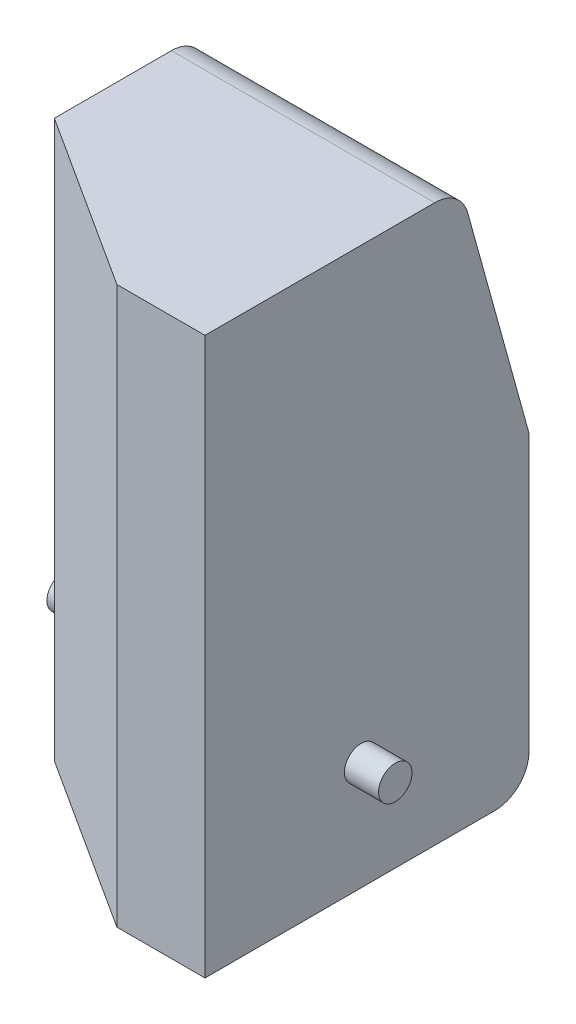
ISO-10303-21;
HEADER;
FILE_DESCRIPTION(('STEP AP214'),'2;1');
FILE_NAME('part.step','',(''),(''),'','','');
FILE_SCHEMA(('AUTOMOTIVE_DESIGN { 1 0 10303 214 1 1 1 1 }'));
ENDSEC;
DATA;
#1=APPLICATION_CONTEXT('core data for automotive mechanical design processes');
#2=APPLICATION_PROTOCOL_DEFINITION('international standard','automotive_design',2000,#1);
#3=PRODUCT_CONTEXT('',#1,'mechanical');
#4=PRODUCT('Part','Part','',(#3));
#5=PRODUCT_RELATED_PRODUCT_CATEGORY('part','',(#4));
#6=PRODUCT_DEFINITION_FORMATION('','',#4);
#7=PRODUCT_DEFINITION_CONTEXT('part definition',#1,'design');
#8=PRODUCT_DEFINITION('design','',#6,#7);
#9=PRODUCT_DEFINITION_SHAPE('','',#8);
#10=(LENGTH_UNIT() NAMED_UNIT(*) SI_UNIT(.MILLI.,.METRE.));
#11=(NAMED_UNIT(*) PLANE_ANGLE_UNIT() SI_UNIT($,.RADIAN.));
#12=(NAMED_UNIT(*) SI_UNIT($,.STERADIAN.) SOLID_ANGLE_UNIT());
#13=UNCERTAINTY_MEASURE_WITH_UNIT(LENGTH_MEASURE(1.E-05),#10,'distance_accuracy_value','');
#14=(GEOMETRIC_REPRESENTATION_CONTEXT(3) GLOBAL_UNCERTAINTY_ASSIGNED_CONTEXT((#13)) GLOBAL_UNIT_ASSIGNED_CONTEXT((#10,
#11,#12)) REPRESENTATION_CONTEXT('',''));
#15=CARTESIAN_POINT('',(0.,0.,0.));
#16=DIRECTION('',(0.,0.,1.));
#17=DIRECTION('',(1.,0.,0.));
#18=AXIS2_PLACEMENT_3D('',#15,#16,#17);
#19=CARTESIAN_POINT('',(-38.56,-163.,-47.45));
#20=DIRECTION('',(-1.,0.,0.));
#21=DIRECTION('',(0.,0.,1.));
#22=AXIS2_PLACEMENT_3D('',#19,#20,#21);
#23=PLANE('',#22);
#24=CARTESIAN_POINT('',(-38.56,-131.263122252948,1.72));
#25=DIRECTION('',(-1.,0.,0.));
#26=DIRECTION('',(0.,0.,1.));
#27=AXIS2_PLACEMENT_3D('',#24,#25,#26);
#28=CIRCLE('',#27,4.9);
#29=CARTESIAN_POINT('',(-38.56,-131.263122252948,-3.17999999999999));
#30=VERTEX_POINT('',#29);
#31=EDGE_CURVE('E12',#30,#30,#28,.T.);
#32=ORIENTED_EDGE('',*,*,#31,.F.);
#33=EDGE_LOOP('',(#32));
#34=FACE_BOUND('',#33,.T.);
#35=DIRECTION('',(0.,1.,0.));
#36=VECTOR('',#35,1.);
#37=CARTESIAN_POINT('',(-38.56,-163.,-47.45));
#38=LINE('',#37,#36);
#39=CARTESIAN_POINT('',(-38.56,-153.,-47.45));
#40=VERTEX_POINT('',#39);
#41=CARTESIAN_POINT('',(-38.56,-72.29,-47.45));
#42=VERTEX_POINT('',#41);
#43=EDGE_CURVE('E138',#40,#42,#38,.T.);
#44=ORIENTED_EDGE('',*,*,#43,.F.);
#45=CARTESIAN_POINT('',(-38.56,-153.,-37.45));
#46=DIRECTION('',(-1.,0.,0.));
#47=DIRECTION('',(0.,0.,1.));
#48=AXIS2_PLACEMENT_3D('',#45,#46,#47);
#49=CIRCLE('',#48,10.);
#50=CARTESIAN_POINT('',(-38.56,-163.,-37.45));
#51=VERTEX_POINT('',#50);
#52=EDGE_CURVE('E209',#40,#51,#49,.T.);
#53=ORIENTED_EDGE('',*,*,#52,.T.);
#54=DIRECTION('',(0.,0.,1.));
#55=VECTOR('',#54,1.);
#56=CARTESIAN_POINT('',(-38.56,-163.,-47.45));
#57=LINE('',#56,#55);
#58=CARTESIAN_POINT('',(-38.56,-163.,14.45));
#59=VERTEX_POINT('',#58);
#60=EDGE_CURVE('E246',#51,#59,#57,.T.);
#61=ORIENTED_EDGE('',*,*,#60,.T.);
#62=DIRECTION('',(0.,1.,0.));
#63=VECTOR('',#62,1.);
#64=CARTESIAN_POINT('',(-38.56,-163.,14.45));
#65=LINE('',#64,#63);
#66=CARTESIAN_POINT('',(-38.56,0.,14.45));
#67=VERTEX_POINT('',#66);
#68=EDGE_CURVE('E238',#59,#67,#65,.T.);
#69=ORIENTED_EDGE('',*,*,#68,.T.);
#70=DIRECTION('',(0.,0.,1.));
#71=VECTOR('',#70,1.);
#72=CARTESIAN_POINT('',(-38.56,0.,-47.45));
#73=LINE('',#72,#71);
#74=CARTESIAN_POINT('',(-38.56,0.,-19.8409770200254));
#75=VERTEX_POINT('',#74);
#76=EDGE_CURVE('E179',#75,#67,#73,.T.);
#77=ORIENTED_EDGE('',*,*,#76,.F.);
#78=CARTESIAN_POINT('',(-38.56,-10.,-19.8409770200254));
#79=DIRECTION('',(-1.,0.,0.));
#80=DIRECTION('',(0.,0.,1.));
#81=AXIS2_PLACEMENT_3D('',#78,#79,#80);
#82=CIRCLE('',#81,10.);
#83=CARTESIAN_POINT('',(-38.56,-7.33353339378044,-29.478920568206));
#84=VERTEX_POINT('',#83);
#85=EDGE_CURVE('E141',#75,#84,#82,.T.);
#86=ORIENTED_EDGE('',*,*,#85,.T.);
#87=DIRECTION('',(0.,-0.963794354818059,-0.266646660621956));
#88=VECTOR('',#87,1.);
#89=CARTESIAN_POINT('',(-38.56,0.,-27.45));
#90=LINE('',#89,#88);
#91=EDGE_CURVE('E136',#84,#42,#90,.T.);
#92=ORIENTED_EDGE('',*,*,#91,.T.);
#93=EDGE_LOOP('',(#44,#53,#61,#69,#77,#86,#92));
#94=FACE_BOUND('',#93,.T.);
#95=ADVANCED_FACE('F36',(#34,#94),#23,.T.);
#96=CARTESIAN_POINT('',(-38.56,-163.,-47.45));
#97=DIRECTION('',(0.,0.,-1.));
#98=DIRECTION('',(-1.,0.,0.));
#99=AXIS2_PLACEMENT_3D('',#96,#97,#98);
#100=PLANE('',#99);
#101=CARTESIAN_POINT('',(0.,-129.37,-47.45));
#102=DIRECTION('',(0.,0.,-1.));
#103=DIRECTION('',(-1.,0.,0.));
#104=AXIS2_PLACEMENT_3D('',#101,#102,#103);
#105=CIRCLE('',#104,10.5);
#106=CARTESIAN_POINT('',(-10.5,-129.37,-47.45));
#107=VERTEX_POINT('',#106);
#108=EDGE_CURVE('E326',#107,#107,#105,.T.);
#109=ORIENTED_EDGE('',*,*,#108,.F.);
#110=EDGE_LOOP('',(#109));
#111=FACE_BOUND('',#110,.T.);
#112=DIRECTION('',(0.,1.,0.));
#113=VECTOR('',#112,1.);
#114=CARTESIAN_POINT('',(38.56,-163.,-47.45));
#115=LINE('',#114,#113);
#116=CARTESIAN_POINT('',(38.56,-153.,-47.45));
#117=VERTEX_POINT('',#116);
#118=CARTESIAN_POINT('',(38.56,-72.29,-47.45));
#119=VERTEX_POINT('',#118);
#120=EDGE_CURVE('E159',#117,#119,#115,.T.);
#121=ORIENTED_EDGE('',*,*,#120,.F.);
#122=DIRECTION('',(-1.,0.,0.));
#123=VECTOR('',#122,1.);
#124=CARTESIAN_POINT('',(-38.56,-153.,-47.45));
#125=LINE('',#124,#123);
#126=EDGE_CURVE('E157',#117,#40,#125,.T.);
#127=ORIENTED_EDGE('',*,*,#126,.T.);
#128=ORIENTED_EDGE('',*,*,#43,.T.);
#129=DIRECTION('',(1.,0.,0.));
#130=VECTOR('',#129,1.);
#131=CARTESIAN_POINT('',(-38.56,-72.29,-47.45));
#132=LINE('',#131,#130);
#133=CARTESIAN_POINT('',(12.75,-72.29,-47.45));
#134=VERTEX_POINT('',#133);
#135=EDGE_CURVE('E155',#42,#134,#132,.T.);
#136=ORIENTED_EDGE('',*,*,#135,.T.);
#137=EDGE_CURVE('E144',#134,#119,#132,.T.);
#138=ORIENTED_EDGE('',*,*,#137,.T.);
#139=EDGE_LOOP('',(#121,#127,#128,#136,#138));
#140=FACE_BOUND('',#139,.T.);
#141=ADVANCED_FACE('F152',(#111,#140),#100,.T.);
#142=CARTESIAN_POINT('',(38.56,-163.,-47.45));
#143=DIRECTION('',(1.,0.,0.));
#144=DIRECTION('',(0.,0.,-1.));
#145=AXIS2_PLACEMENT_3D('',#142,#143,#144);
#146=PLANE('',#145);
#147=CARTESIAN_POINT('',(38.56,-131.263122252948,1.71999999999999));
#148=DIRECTION('',(1.,0.,0.));
#149=DIRECTION('',(0.,0.,-1.));
#150=AXIS2_PLACEMENT_3D('',#147,#148,#149);
#151=CIRCLE('',#150,4.9);
#152=CARTESIAN_POINT('',(38.56,-131.263122252948,-3.18));
#153=VERTEX_POINT('',#152);
#154=EDGE_CURVE('E40',#153,#153,#151,.T.);
#155=ORIENTED_EDGE('',*,*,#154,.F.);
#156=EDGE_LOOP('',(#155));
#157=FACE_BOUND('',#156,.T.);
#158=DIRECTION('',(0.,0.,-1.));
#159=VECTOR('',#158,1.);
#160=CARTESIAN_POINT('',(38.56,-163.,-47.45));
#161=LINE('',#160,#159);
#162=CARTESIAN_POINT('',(38.56,-163.,47.45));
#163=VERTEX_POINT('',#162);
#164=CARTESIAN_POINT('',(38.56,-163.,-37.45));
#165=VERTEX_POINT('',#164);
#166=EDGE_CURVE('E231',#163,#165,#161,.T.);
#167=ORIENTED_EDGE('',*,*,#166,.T.);
#168=CARTESIAN_POINT('',(38.56,-153.,-37.45));
#169=DIRECTION('',(1.,0.,0.));
#170=DIRECTION('',(0.,0.,-1.));
#171=AXIS2_PLACEMENT_3D('',#168,#169,#170);
#172=CIRCLE('',#171,10.);
#173=EDGE_CURVE('E214',#165,#117,#172,.T.);
#174=ORIENTED_EDGE('',*,*,#173,.T.);
#175=ORIENTED_EDGE('',*,*,#120,.T.);
#176=DIRECTION('',(0.,-0.963794354818059,-0.266646660621956));
#177=VECTOR('',#176,1.);
#178=CARTESIAN_POINT('',(38.56,0.,-27.45));
#179=LINE('',#178,#177);
#180=CARTESIAN_POINT('',(38.56,-7.33353339378044,-29.478920568206));
#181=VERTEX_POINT('',#180);
#182=EDGE_CURVE('E145',#181,#119,#179,.T.);
#183=ORIENTED_EDGE('',*,*,#182,.F.);
#184=CARTESIAN_POINT('',(38.56,-10.,-19.8409770200254));
#185=DIRECTION('',(1.,0.,0.));
#186=DIRECTION('',(0.,0.,-1.));
#187=AXIS2_PLACEMENT_3D('',#184,#185,#186);
#188=CIRCLE('',#187,10.);
#189=CARTESIAN_POINT('',(38.56,0.,-19.8409770200254));
#190=VERTEX_POINT('',#189);
#191=EDGE_CURVE('E52',#181,#190,#188,.T.);
#192=ORIENTED_EDGE('',*,*,#191,.T.);
#193=DIRECTION('',(0.,0.,-1.));
#194=VECTOR('',#193,1.);
#195=CARTESIAN_POINT('',(38.56,0.,-47.45));
#196=LINE('',#195,#194);
#197=CARTESIAN_POINT('',(38.56,0.,47.45));
#198=VERTEX_POINT('',#197);
#199=EDGE_CURVE('E252',#198,#190,#196,.T.);
#200=ORIENTED_EDGE('',*,*,#199,.F.);
#201=DIRECTION('',(0.,1.,0.));
#202=VECTOR('',#201,1.);
#203=CARTESIAN_POINT('',(38.56,-163.,47.45));
#204=LINE('',#203,#202);
#205=EDGE_CURVE('E234',#163,#198,#204,.T.);
#206=ORIENTED_EDGE('',*,*,#205,.F.);
#207=EDGE_LOOP('',(#167,#174,#175,#183,#192,#200,#206));
#208=FACE_BOUND('',#207,.T.);
#209=ADVANCED_FACE('F225',(#157,#208),#146,.T.);
#210=CARTESIAN_POINT('',(12.75,-163.,47.45));
#211=DIRECTION('',(0.,0.,1.));
#212=DIRECTION('',(1.,0.,0.));
#213=AXIS2_PLACEMENT_3D('',#210,#211,#212);
#214=PLANE('',#213);
#215=DIRECTION('',(1.,0.,0.));
#216=VECTOR('',#215,1.);
#217=CARTESIAN_POINT('',(12.75,0.,47.45));
#218=LINE('',#217,#216);
#219=CARTESIAN_POINT('',(12.75,0.,47.45));
#220=VERTEX_POINT('',#219);
#221=EDGE_CURVE('E255',#220,#198,#218,.T.);
#222=ORIENTED_EDGE('',*,*,#221,.F.);
#223=DIRECTION('',(0.,1.,0.));
#224=VECTOR('',#223,1.);
#225=CARTESIAN_POINT('',(12.75,-163.,47.45));
#226=LINE('',#225,#224);
#227=CARTESIAN_POINT('',(12.75,-163.,47.45));
#228=VERTEX_POINT('',#227);
#229=EDGE_CURVE('E268',#228,#220,#226,.T.);
#230=ORIENTED_EDGE('',*,*,#229,.F.);
#231=DIRECTION('',(1.,0.,0.));
#232=VECTOR('',#231,1.);
#233=CARTESIAN_POINT('',(12.75,-163.,47.45));
#234=LINE('',#233,#232);
#235=EDGE_CURVE('E239',#228,#163,#234,.T.);
#236=ORIENTED_EDGE('',*,*,#235,.T.);
#237=ORIENTED_EDGE('',*,*,#205,.T.);
#238=EDGE_LOOP('',(#222,#230,#236,#237));
#239=FACE_BOUND('',#238,.T.);
#240=ADVANCED_FACE('F227',(#239),#214,.T.);
#241=CARTESIAN_POINT('',(-38.56,-163.,14.45));
#242=DIRECTION('',(-0.540931558391022,0.,0.84106661397101));
#243=DIRECTION('',(0.84106661397101,0.,0.540931558391022));
#244=AXIS2_PLACEMENT_3D('',#241,#242,#243);
#245=PLANE('',#244);
#246=DIRECTION('',(0.84106661397101,0.,0.540931558391022));
#247=VECTOR('',#246,1.);
#248=CARTESIAN_POINT('',(-38.56,0.,14.45));
#249=LINE('',#248,#247);
#250=EDGE_CURVE('E261',#67,#220,#249,.T.);
#251=ORIENTED_EDGE('',*,*,#250,.F.);
#252=ORIENTED_EDGE('',*,*,#68,.F.);
#253=DIRECTION('',(0.84106661397101,0.,0.540931558391022));
#254=VECTOR('',#253,1.);
#255=CARTESIAN_POINT('',(-38.56,-163.,14.45));
#256=LINE('',#255,#254);
#257=EDGE_CURVE('E251',#59,#228,#256,.T.);
#258=ORIENTED_EDGE('',*,*,#257,.T.);
#259=ORIENTED_EDGE('',*,*,#229,.T.);
#260=EDGE_LOOP('',(#251,#252,#258,#259));
#261=FACE_BOUND('',#260,.T.);
#262=ADVANCED_FACE('F271',(#261),#245,.T.);
#263=CARTESIAN_POINT('',(0.,-163.,0.));
#264=DIRECTION('',(0.,1.,0.));
#265=DIRECTION('',(0.,0.,1.));
#266=AXIS2_PLACEMENT_3D('',#263,#264,#265);
#267=PLANE('',#266);
#268=ORIENTED_EDGE('',*,*,#60,.F.);
#269=DIRECTION('',(-1.,0.,0.));
#270=VECTOR('',#269,1.);
#271=CARTESIAN_POINT('',(38.56,-163.,-37.45));
#272=LINE('',#271,#270);
#273=EDGE_CURVE('E211',#51,#165,#272,.F.);
#274=ORIENTED_EDGE('',*,*,#273,.T.);
#275=ORIENTED_EDGE('',*,*,#166,.F.);
#276=ORIENTED_EDGE('',*,*,#235,.F.);
#277=ORIENTED_EDGE('',*,*,#257,.F.);
#278=EDGE_LOOP('',(#268,#274,#275,#276,#277));
#279=FACE_BOUND('',#278,.T.);
#280=ADVANCED_FACE('F249',(#279),#267,.F.);
#281=CARTESIAN_POINT('',(0.,0.,0.));
#282=DIRECTION('',(0.,1.,0.));
#283=DIRECTION('',(0.,0.,1.));
#284=AXIS2_PLACEMENT_3D('',#281,#282,#283);
#285=PLANE('',#284);
#286=ORIENTED_EDGE('',*,*,#199,.T.);
#287=DIRECTION('',(1.,0.,0.));
#288=VECTOR('',#287,1.);
#289=CARTESIAN_POINT('',(-38.56,0.,-19.8409770200254));
#290=LINE('',#289,#288);
#291=EDGE_CURVE('E217',#190,#75,#290,.F.);
#292=ORIENTED_EDGE('',*,*,#291,.T.);
#293=ORIENTED_EDGE('',*,*,#76,.T.);
#294=ORIENTED_EDGE('',*,*,#250,.T.);
#295=ORIENTED_EDGE('',*,*,#221,.T.);
#296=EDGE_LOOP('',(#286,#292,#293,#294,#295));
#297=FACE_BOUND('',#296,.T.);
#298=ADVANCED_FACE('F273',(#297),#285,.T.);
#299=CARTESIAN_POINT('',(-38.56,0.,-27.45));
#300=DIRECTION('',(0.,-0.266646660621956,0.96379435481806));
#301=DIRECTION('',(0.,-0.96379435481806,-0.266646660621956));
#302=AXIS2_PLACEMENT_3D('',#299,#300,#301);
#303=PLANE('',#302);
#304=ORIENTED_EDGE('',*,*,#91,.F.);
#305=DIRECTION('',(1.,0.,0.));
#306=VECTOR('',#305,1.);
#307=CARTESIAN_POINT('',(38.56,-7.33353339378044,-29.478920568206));
#308=LINE('',#307,#306);
#309=EDGE_CURVE('E216',#84,#181,#308,.T.);
#310=ORIENTED_EDGE('',*,*,#309,.T.);
#311=ORIENTED_EDGE('',*,*,#182,.T.);
#312=ORIENTED_EDGE('',*,*,#137,.F.);
#313=DIRECTION('',(-0.328725796039172,0.910231876645725,0.25182788121337));
#314=VECTOR('',#313,1.);
#315=CARTESIAN_POINT('',(-16.0806134286694,7.5411044713329,-25.3636521036567));
#316=LINE('',#315,#314);
#317=CARTESIAN_POINT('',(11.1254993804371,-67.7918064740479,-46.205514310153));
#318=VERTEX_POINT('',#317);
#319=EDGE_CURVE('E185',#134,#318,#316,.T.);
#320=ORIENTED_EDGE('',*,*,#319,.T.);
#321=DIRECTION('',(1.,0.,0.));
#322=VECTOR('',#321,1.);
#323=CARTESIAN_POINT('',(-38.56,-67.7918064740479,-46.205514310153));
#324=LINE('',#323,#322);
#325=CARTESIAN_POINT('',(-36.9354993804372,-67.7918064740479,-46.205514310153));
#326=VERTEX_POINT('',#325);
#327=EDGE_CURVE('E158',#326,#318,#324,.T.);
#328=ORIENTED_EDGE('',*,*,#327,.F.);
#329=DIRECTION('',(-0.328725796039172,-0.910231876645725,-0.25182788121337));
#330=VECTOR('',#329,1.);
#331=CARTESIAN_POINT('',(-15.2739784705759,-7.81170431487893,-29.6112129796318));
#332=LINE('',#331,#330);
#333=EDGE_CURVE('E167',#326,#42,#332,.T.);
#334=ORIENTED_EDGE('',*,*,#333,.T.);
#335=EDGE_LOOP('',(#304,#310,#311,#312,#320,#328,#334));
#336=FACE_BOUND('',#335,.T.);
#337=ADVANCED_FACE('F182',(#336),#303,.F.);
#338=CARTESIAN_POINT('',(1.99499999999997,-49.5114920011426,-54.5498924883401));
#339=DIRECTION('',(0.910425743719144,0.376320584308292,-0.171778296065915));
#340=DIRECTION('',(-0.381998753667224,0.924162838571584,0.));
#341=AXIS2_PLACEMENT_3D('',#338,#339,#340);
#342=PLANE('',#341);
#343=DIRECTION('',(0.413672533743109,-0.828220198101095,0.378055998873101));
#344=VECTOR('',#343,1.);
#345=CARTESIAN_POINT('',(1.99499999999997,-50.7572476318941,-57.2790119266299));
#346=LINE('',#345,#344);
#347=CARTESIAN_POINT('',(4.65911149116721,-56.0911065831103,-54.8442761181171));
#348=VERTEX_POINT('',#347);
#349=EDGE_CURVE('E177',#348,#134,#346,.T.);
#350=ORIENTED_EDGE('',*,*,#349,.F.);
#351=DIRECTION('',(0.,-0.415251876917188,-0.909706479429905));
#352=VECTOR('',#351,1.);
#353=CARTESIAN_POINT('',(4.65911149116721,-54.8453509523587,-52.1151566798274));
#354=LINE('',#353,#352);
#355=CARTESIAN_POINT('',(4.65911149116721,-54.8453509523587,-52.1151566798274));
#356=VERTEX_POINT('',#355);
#357=EDGE_CURVE('E205',#348,#356,#354,.F.);
#358=ORIENTED_EDGE('',*,*,#357,.T.);
#359=DIRECTION('',(0.413672533743109,-0.828220198101095,0.378055998873101));
#360=VECTOR('',#359,1.);
#361=CARTESIAN_POINT('',(1.99499999999997,-49.5114920011426,-54.5498924883401));
#362=LINE('',#361,#360);
#363=EDGE_CURVE('E309',#356,#318,#362,.T.);
#364=ORIENTED_EDGE('',*,*,#363,.T.);
#365=ORIENTED_EDGE('',*,*,#319,.F.);
#366=EDGE_LOOP('',(#350,#358,#364,#365));
#367=FACE_BOUND('',#366,.T.);
#368=ADVANCED_FACE('F358',(#367),#342,.T.);
#369=CARTESIAN_POINT('',(-38.56,-71.0442443692484,-44.7208805617103));
#370=DIRECTION('',(-0.910425743719144,0.376320584308292,-0.171778296065915));
#371=DIRECTION('',(-0.381998753667224,-0.924162838571584,0.));
#372=AXIS2_PLACEMENT_3D('',#369,#370,#371);
#373=PLANE('',#372);
#374=DIRECTION('',(0.413672533743109,0.828220198101095,-0.378055998873102));
#375=VECTOR('',#374,1.);
#376=CARTESIAN_POINT('',(-38.56,-71.0442443692484,-44.7208805617103));
#377=LINE('',#376,#375);
#378=CARTESIAN_POINT('',(-30.4691114911673,-54.8453509523587,-52.1151566798274));
#379=VERTEX_POINT('',#378);
#380=EDGE_CURVE('E314',#326,#379,#377,.T.);
#381=ORIENTED_EDGE('',*,*,#380,.T.);
#382=DIRECTION('',(0.,-0.415251876917188,-0.909706479429905));
#383=VECTOR('',#382,1.);
#384=CARTESIAN_POINT('',(-30.4691114911673,-54.8453509523587,-52.1151566798274));
#385=LINE('',#384,#383);
#386=CARTESIAN_POINT('',(-30.4691114911673,-56.0911065831103,-54.8442761181171));
#387=VERTEX_POINT('',#386);
#388=EDGE_CURVE('E170',#379,#387,#385,.T.);
#389=ORIENTED_EDGE('',*,*,#388,.T.);
#390=DIRECTION('',(0.413672533743109,0.828220198101095,-0.378055998873102));
#391=VECTOR('',#390,1.);
#392=CARTESIAN_POINT('',(-38.56,-72.29,-47.45));
#393=LINE('',#392,#391);
#394=EDGE_CURVE('E164',#42,#387,#393,.T.);
#395=ORIENTED_EDGE('',*,*,#394,.F.);
#396=ORIENTED_EDGE('',*,*,#333,.F.);
#397=EDGE_LOOP('',(#381,#389,#395,#396));
#398=FACE_BOUND('',#397,.T.);
#399=ADVANCED_FACE('F166',(#398),#373,.T.);
#400=CARTESIAN_POINT('',(0.,-29.1440919744454,-63.8469583884417));
#401=DIRECTION('',(0.,-0.415251876917188,-0.909706479429905));
#402=DIRECTION('',(0.,0.909706479429905,-0.415251876917188));
#403=AXIS2_PLACEMENT_3D('',#400,#401,#402);
#404=PLANE('',#403);
#405=DIRECTION('',(1.,0.,0.));
#406=VECTOR('',#405,1.);
#407=CARTESIAN_POINT('',(-27.805,-49.5114920011426,-54.5498924883401));
#408=LINE('',#407,#406);
#409=CARTESIAN_POINT('',(-21.3648540539758,-49.5114920011426,-54.5498924883401));
#410=VERTEX_POINT('',#409);
#411=CARTESIAN_POINT('',(-4.44514594602423,-49.5114920011426,-54.5498924883401));
#412=VERTEX_POINT('',#411);
#413=EDGE_CURVE('E310',#410,#412,#408,.T.);
#414=ORIENTED_EDGE('',*,*,#413,.F.);
#415=CARTESIAN_POINT('',(-21.3648540539758,-58.6085567954416,-50.3973737191683));
#416=DIRECTION('',(0.,-0.415251876917188,-0.909706479429905));
#417=DIRECTION('',(0.,0.909706479429905,-0.415251876917188));
#418=AXIS2_PLACEMENT_3D('',#415,#416,#417);
#419=CIRCLE('',#418,10.);
#420=EDGE_CURVE('E203',#410,#379,#419,.F.);
#421=ORIENTED_EDGE('',*,*,#420,.T.);
#422=ORIENTED_EDGE('',*,*,#380,.F.);
#423=ORIENTED_EDGE('',*,*,#327,.T.);
#424=ORIENTED_EDGE('',*,*,#363,.F.);
#425=CARTESIAN_POINT('',(-4.44514594602423,-58.6085567954416,-50.3973737191683));
#426=DIRECTION('',(0.,-0.415251876917188,-0.909706479429905));
#427=DIRECTION('',(0.,0.909706479429905,-0.415251876917188));
#428=AXIS2_PLACEMENT_3D('',#425,#426,#427);
#429=CIRCLE('',#428,10.);
#430=EDGE_CURVE('E201',#356,#412,#429,.F.);
#431=ORIENTED_EDGE('',*,*,#430,.T.);
#432=EDGE_LOOP('',(#414,#421,#422,#423,#424,#431));
#433=FACE_BOUND('',#432,.T.);
#434=ADVANCED_FACE('F351',(#433),#404,.F.);
#435=CARTESIAN_POINT('',(-27.805,-49.5114920011426,-54.5498924883401));
#436=DIRECTION('',(0.,0.909706479429905,-0.415251876917188));
#437=DIRECTION('',(0.,0.415251876917188,0.909706479429905));
#438=AXIS2_PLACEMENT_3D('',#435,#436,#437);
#439=PLANE('',#438);
#440=DIRECTION('',(1.,0.,0.));
#441=VECTOR('',#440,1.);
#442=CARTESIAN_POINT('',(-27.805,-50.7572476318941,-57.2790119266299));
#443=LINE('',#442,#441);
#444=CARTESIAN_POINT('',(-21.3648540539758,-50.7572476318941,-57.2790119266299));
#445=VERTEX_POINT('',#444);
#446=CARTESIAN_POINT('',(-4.44514594602423,-50.7572476318941,-57.2790119266299));
#447=VERTEX_POINT('',#446);
#448=EDGE_CURVE('E172',#445,#447,#443,.T.);
#449=ORIENTED_EDGE('',*,*,#448,.F.);
#450=DIRECTION('',(0.,-0.415251876917188,-0.909706479429905));
#451=VECTOR('',#450,1.);
#452=CARTESIAN_POINT('',(-21.3648540539758,-49.5114920011426,-54.5498924883401));
#453=LINE('',#452,#451);
#454=EDGE_CURVE('E199',#445,#410,#453,.F.);
#455=ORIENTED_EDGE('',*,*,#454,.T.);
#456=ORIENTED_EDGE('',*,*,#413,.T.);
#457=DIRECTION('',(0.,-0.415251876917188,-0.909706479429905));
#458=VECTOR('',#457,1.);
#459=CARTESIAN_POINT('',(-4.44514594602423,-49.5114920011426,-54.5498924883401));
#460=LINE('',#459,#458);
#461=EDGE_CURVE('E196',#412,#447,#460,.T.);
#462=ORIENTED_EDGE('',*,*,#461,.T.);
#463=EDGE_LOOP('',(#449,#455,#456,#462));
#464=FACE_BOUND('',#463,.T.);
#465=ADVANCED_FACE('F354',(#464),#439,.T.);
#466=CARTESIAN_POINT('',(0.,-30.3898476051969,-66.5760778267314));
#467=DIRECTION('',(0.,-0.415251876917188,-0.909706479429905));
#468=DIRECTION('',(0.,0.909706479429905,-0.415251876917188));
#469=AXIS2_PLACEMENT_3D('',#466,#467,#468);
#470=PLANE('',#469);
#471=ORIENTED_EDGE('',*,*,#394,.T.);
#472=CARTESIAN_POINT('',(-21.3648540539758,-59.8543124261932,-53.126493157458));
#473=DIRECTION('',(0.,-0.415251876917188,-0.909706479429905));
#474=DIRECTION('',(0.,0.909706479429905,-0.415251876917188));
#475=AXIS2_PLACEMENT_3D('',#472,#473,#474);
#476=CIRCLE('',#475,10.);
#477=EDGE_CURVE('E194',#387,#445,#476,.T.);
#478=ORIENTED_EDGE('',*,*,#477,.T.);
#479=ORIENTED_EDGE('',*,*,#448,.T.);
#480=CARTESIAN_POINT('',(-4.44514594602423,-59.8543124261932,-53.126493157458));
#481=DIRECTION('',(0.,-0.415251876917188,-0.909706479429905));
#482=DIRECTION('',(0.,0.909706479429905,-0.415251876917188));
#483=AXIS2_PLACEMENT_3D('',#480,#481,#482);
#484=CIRCLE('',#483,10.);
#485=EDGE_CURVE('E192',#447,#348,#484,.T.);
#486=ORIENTED_EDGE('',*,*,#485,.T.);
#487=ORIENTED_EDGE('',*,*,#349,.T.);
#488=ORIENTED_EDGE('',*,*,#135,.F.);
#489=EDGE_LOOP('',(#471,#478,#479,#486,#487,#488));
#490=FACE_BOUND('',#489,.T.);
#491=ADVANCED_FACE('F175',(#490),#470,.T.);
#492=CARTESIAN_POINT('',(-21.3648540539758,-58.6085567954416,-50.3973737191683));
#493=DIRECTION('',(0.,-0.415251876917188,-0.909706479429905));
#494=DIRECTION('',(0.,0.909706479429905,-0.415251876917188));
#495=AXIS2_PLACEMENT_3D('',#492,#493,#494);
#496=CYLINDRICAL_SURFACE('',#495,10.);
#497=ORIENTED_EDGE('',*,*,#420,.F.);
#498=ORIENTED_EDGE('',*,*,#454,.F.);
#499=ORIENTED_EDGE('',*,*,#477,.F.);
#500=ORIENTED_EDGE('',*,*,#388,.F.);
#501=EDGE_LOOP('',(#497,#498,#499,#500));
#502=FACE_BOUND('',#501,.T.);
#503=ADVANCED_FACE('F291',(#502),#496,.T.);
#504=CARTESIAN_POINT('',(-4.44514594602423,-58.6085567954416,-50.3973737191683));
#505=DIRECTION('',(0.,-0.415251876917188,-0.909706479429905));
#506=DIRECTION('',(0.,0.909706479429905,-0.415251876917188));
#507=AXIS2_PLACEMENT_3D('',#504,#505,#506);
#508=CYLINDRICAL_SURFACE('',#507,10.);
#509=ORIENTED_EDGE('',*,*,#430,.F.);
#510=ORIENTED_EDGE('',*,*,#357,.F.);
#511=ORIENTED_EDGE('',*,*,#485,.F.);
#512=ORIENTED_EDGE('',*,*,#461,.F.);
#513=EDGE_LOOP('',(#509,#510,#511,#512));
#514=FACE_BOUND('',#513,.T.);
#515=ADVANCED_FACE('F294',(#514),#508,.T.);
#516=CARTESIAN_POINT('',(-38.56,-153.,-37.45));
#517=DIRECTION('',(1.,0.,0.));
#518=DIRECTION('',(0.,0.,-1.));
#519=AXIS2_PLACEMENT_3D('',#516,#517,#518);
#520=CYLINDRICAL_SURFACE('',#519,10.);
#521=ORIENTED_EDGE('',*,*,#173,.F.);
#522=ORIENTED_EDGE('',*,*,#273,.F.);
#523=ORIENTED_EDGE('',*,*,#52,.F.);
#524=ORIENTED_EDGE('',*,*,#126,.F.);
#525=EDGE_LOOP('',(#521,#522,#523,#524));
#526=FACE_BOUND('',#525,.T.);
#527=ADVANCED_FACE('F243',(#526),#520,.T.);
#528=CARTESIAN_POINT('',(-38.56,-10.,-19.8409770200254));
#529=DIRECTION('',(-1.,0.,0.));
#530=DIRECTION('',(0.,0.,1.));
#531=AXIS2_PLACEMENT_3D('',#528,#529,#530);
#532=CYLINDRICAL_SURFACE('',#531,10.);
#533=ORIENTED_EDGE('',*,*,#85,.F.);
#534=ORIENTED_EDGE('',*,*,#291,.F.);
#535=ORIENTED_EDGE('',*,*,#191,.F.);
#536=ORIENTED_EDGE('',*,*,#309,.F.);
#537=EDGE_LOOP('',(#533,#534,#535,#536));
#538=FACE_BOUND('',#537,.T.);
#539=ADVANCED_FACE('F38',(#538),#532,.T.);
#540=CARTESIAN_POINT('',(48.56,-131.263122252948,1.71999999999999));
#541=DIRECTION('',(1.,0.,0.));
#542=DIRECTION('',(0.,0.,-1.));
#543=AXIS2_PLACEMENT_3D('',#540,#541,#542);
#544=PLANE('',#543);
#545=CARTESIAN_POINT('',(48.56,-131.263122252948,1.71999999999999));
#546=DIRECTION('',(1.,0.,0.));
#547=DIRECTION('',(0.,0.,-1.));
#548=AXIS2_PLACEMENT_3D('',#545,#546,#547);
#549=CIRCLE('',#548,4.9);
#550=CARTESIAN_POINT('',(48.56,-131.263122252948,-3.18000000000001));
#551=VERTEX_POINT('',#550);
#552=EDGE_CURVE('E322',#551,#551,#549,.T.);
#553=ORIENTED_EDGE('',*,*,#552,.T.);
#554=EDGE_LOOP('',(#553));
#555=FACE_BOUND('',#554,.T.);
#556=ADVANCED_FACE('F302',(#555),#544,.T.);
#557=CARTESIAN_POINT('',(-72.4192929112563,-131.263122252948,1.72000000000001));
#558=DIRECTION('',(1.,0.,0.));
#559=DIRECTION('',(0.,0.,-1.));
#560=AXIS2_PLACEMENT_3D('',#557,#558,#559);
#561=CYLINDRICAL_SURFACE('',#560,4.9);
#562=CARTESIAN_POINT('',(38.56,-131.263122252948,-3.18));
#563=CARTESIAN_POINT('',(38.6641666666667,-131.263122252948,-3.18));
#564=CARTESIAN_POINT('',(38.7683333333333,-131.263122252948,-3.18));
#565=CARTESIAN_POINT('',(38.9766666666667,-131.263122252948,-3.18));
#566=CARTESIAN_POINT('',(39.0808333333333,-131.263122252948,-3.18));
#567=CARTESIAN_POINT('',(39.2891666666667,-131.263122252948,-3.18));
#568=CARTESIAN_POINT('',(39.3933333333333,-131.263122252948,-3.18));
#569=CARTESIAN_POINT('',(39.6016666666667,-131.263122252948,-3.18));
#570=CARTESIAN_POINT('',(39.7058333333333,-131.263122252948,-3.18));
#571=CARTESIAN_POINT('',(39.9141666666667,-131.263122252948,-3.18));
#572=CARTESIAN_POINT('',(40.0183333333333,-131.263122252948,-3.18));
#573=CARTESIAN_POINT('',(40.2266666666667,-131.263122252948,-3.18));
#574=CARTESIAN_POINT('',(40.3308333333333,-131.263122252948,-3.18));
#575=CARTESIAN_POINT('',(40.5391666666667,-131.263122252948,-3.18));
#576=CARTESIAN_POINT('',(40.6433333333333,-131.263122252948,-3.18));
#577=CARTESIAN_POINT('',(40.8516666666667,-131.263122252948,-3.18));
#578=CARTESIAN_POINT('',(40.9558333333333,-131.263122252948,-3.18));
#579=CARTESIAN_POINT('',(41.1641666666667,-131.263122252948,-3.18));
#580=CARTESIAN_POINT('',(41.2683333333333,-131.263122252948,-3.18));
#581=CARTESIAN_POINT('',(41.4766666666667,-131.263122252948,-3.18));
#582=CARTESIAN_POINT('',(41.5808333333333,-131.263122252948,-3.18));
#583=CARTESIAN_POINT('',(41.7891666666667,-131.263122252948,-3.18));
#584=CARTESIAN_POINT('',(41.8933333333333,-131.263122252948,-3.18));
#585=CARTESIAN_POINT('',(42.1016666666667,-131.263122252948,-3.18));
#586=CARTESIAN_POINT('',(42.2058333333333,-131.263122252948,-3.18));
#587=CARTESIAN_POINT('',(42.4141666666667,-131.263122252948,-3.18));
#588=CARTESIAN_POINT('',(42.5183333333333,-131.263122252948,-3.18));
#589=CARTESIAN_POINT('',(42.7266666666667,-131.263122252948,-3.18));
#590=CARTESIAN_POINT('',(42.8308333333333,-131.263122252948,-3.18));
#591=CARTESIAN_POINT('',(43.0391666666667,-131.263122252948,-3.18));
#592=CARTESIAN_POINT('',(43.1433333333333,-131.263122252948,-3.18));
#593=CARTESIAN_POINT('',(43.3516666666667,-131.263122252948,-3.18));
#594=CARTESIAN_POINT('',(43.4558333333333,-131.263122252948,-3.18));
#595=CARTESIAN_POINT('',(43.6641666666667,-131.263122252948,-3.18));
#596=CARTESIAN_POINT('',(43.7683333333333,-131.263122252948,-3.18));
#597=CARTESIAN_POINT('',(43.9766666666667,-131.263122252948,-3.18));
#598=CARTESIAN_POINT('',(44.0808333333333,-131.263122252948,-3.18));
#599=CARTESIAN_POINT('',(44.2891666666667,-131.263122252948,-3.18));
#600=CARTESIAN_POINT('',(44.3933333333333,-131.263122252948,-3.18));
#601=CARTESIAN_POINT('',(44.6016666666667,-131.263122252948,-3.18));
#602=CARTESIAN_POINT('',(44.7058333333333,-131.263122252948,-3.18000000000001));
#603=CARTESIAN_POINT('',(44.9141666666667,-131.263122252948,-3.18000000000001));
#604=CARTESIAN_POINT('',(45.0183333333333,-131.263122252948,-3.18000000000001));
#605=CARTESIAN_POINT('',(45.2266666666667,-131.263122252948,-3.18000000000001));
#606=CARTESIAN_POINT('',(45.3308333333333,-131.263122252948,-3.18000000000001));
#607=CARTESIAN_POINT('',(45.5391666666667,-131.263122252948,-3.18000000000001));
#608=CARTESIAN_POINT('',(45.6433333333333,-131.263122252948,-3.18000000000001));
#609=CARTESIAN_POINT('',(45.8516666666666,-131.263122252948,-3.18000000000001));
#610=CARTESIAN_POINT('',(45.9558333333333,-131.263122252948,-3.18000000000001));
#611=CARTESIAN_POINT('',(46.1641666666666,-131.263122252948,-3.18000000000001));
#612=CARTESIAN_POINT('',(46.2683333333333,-131.263122252948,-3.18000000000001));
#613=CARTESIAN_POINT('',(46.4766666666666,-131.263122252948,-3.18000000000001));
#614=CARTESIAN_POINT('',(46.5808333333333,-131.263122252948,-3.18000000000001));
#615=CARTESIAN_POINT('',(46.7891666666666,-131.263122252948,-3.18000000000001));
#616=CARTESIAN_POINT('',(46.8933333333333,-131.263122252948,-3.18000000000001));
#617=CARTESIAN_POINT('',(47.1016666666666,-131.263122252948,-3.18000000000001));
#618=CARTESIAN_POINT('',(47.2058333333333,-131.263122252948,-3.18000000000001));
#619=CARTESIAN_POINT('',(47.4141666666666,-131.263122252948,-3.18000000000001));
#620=CARTESIAN_POINT('',(47.5183333333333,-131.263122252948,-3.18000000000001));
#621=CARTESIAN_POINT('',(47.7266666666666,-131.263122252948,-3.18000000000001));
#622=CARTESIAN_POINT('',(47.8308333333333,-131.263122252948,-3.18000000000001));
#623=CARTESIAN_POINT('',(48.0391666666666,-131.263122252948,-3.18000000000001));
#624=CARTESIAN_POINT('',(48.1433333333333,-131.263122252948,-3.18000000000001));
#625=CARTESIAN_POINT('',(48.3516666666666,-131.263122252948,-3.18000000000001));
#626=CARTESIAN_POINT('',(48.4558333333333,-131.263122252948,-3.18000000000001));
#627=CARTESIAN_POINT('',(48.56,-131.263122252948,-3.18000000000001));
#628=B_SPLINE_CURVE_WITH_KNOTS('',3,(#562,#563,#564,#565,#566,#567,#568,#569,#570,#571,#572,
#573,#574,#575,#576,#577,#578,#579,#580,#581,#582,#583,#584,#585,#586,#587,#588,#589,#590,#591,
#592,#593,#594,#595,#596,#597,#598,#599,#600,#601,#602,#603,#604,#605,#606,#607,#608,#609,#610,
#611,#612,#613,#614,#615,#616,#617,#618,#619,#620,#621,#622,#623,#624,#625,#626,#627),
.UNSPECIFIED.,.F.,.F.,(4,2,2,2,2,2,2,2,2,2,2,2,2,2,2,2,2,2,2,2,2,2,2,2,2,2,2,2,2,2,2,2,4),(0.,
0.312499999999993,0.625000000000001,0.937499999999994,1.25,1.56249999999999,1.875,2.1875,2.5,
2.8125,3.12499999999999,3.4375,3.74999999999999,4.0625,4.37499999999999,4.6875,4.99999999999999,
5.31249999999998,5.62499999999999,5.93749999999998,6.24999999999999,6.56249999999998,
6.87499999999999,7.18749999999999,7.49999999999998,7.81249999999999,8.12499999999998,
8.43749999999999,8.74999999999998,9.06249999999999,9.37499999999998,9.68749999999999,
9.99999999999998),.UNSPECIFIED.);
#629=EDGE_CURVE('BSEAM222',#153,#551,#628,.T.);
#630=ORIENTED_EDGE('',*,*,#154,.T.);
#631=ORIENTED_EDGE('',*,*,#552,.F.);
#632=ORIENTED_EDGE('',*,*,#629,.T.);
#633=ORIENTED_EDGE('',*,*,#629,.F.);
#634=EDGE_LOOP('',(#630,#632,#631,#633));
#635=FACE_BOUND('',#634,.T.);
#636=ADVANCED_FACE('F222',(#635),#561,.T.);
#637=CARTESIAN_POINT('',(-48.56,-131.263122252948,1.72000000000001));
#638=DIRECTION('',(-1.,0.,0.));
#639=DIRECTION('',(0.,0.,1.));
#640=AXIS2_PLACEMENT_3D('',#637,#638,#639);
#641=CIRCLE('',#640,4.9);
#642=CARTESIAN_POINT('',(-48.56,-131.263122252948,-3.17999999999999));
#643=VERTEX_POINT('',#642);
#644=EDGE_CURVE('E173',#643,#643,#641,.F.);
#645=CARTESIAN_POINT('',(-38.56,-131.263122252948,-3.17999999999999));
#646=CARTESIAN_POINT('',(-38.6641666666667,-131.263122252948,-3.17999999999999));
#647=CARTESIAN_POINT('',(-38.7683333333334,-131.263122252948,-3.17999999999999));
#648=CARTESIAN_POINT('',(-38.9766666666667,-131.263122252948,-3.17999999999999));
#649=CARTESIAN_POINT('',(-39.0808333333334,-131.263122252948,-3.17999999999999));
#650=CARTESIAN_POINT('',(-39.2891666666667,-131.263122252948,-3.17999999999999));
#651=CARTESIAN_POINT('',(-39.3933333333334,-131.263122252948,-3.17999999999999));
#652=CARTESIAN_POINT('',(-39.6016666666667,-131.263122252948,-3.17999999999999));
#653=CARTESIAN_POINT('',(-39.7058333333334,-131.263122252948,-3.17999999999999));
#654=CARTESIAN_POINT('',(-39.9141666666667,-131.263122252948,-3.17999999999999));
#655=CARTESIAN_POINT('',(-40.0183333333334,-131.263122252948,-3.17999999999999));
#656=CARTESIAN_POINT('',(-40.2266666666667,-131.263122252948,-3.17999999999999));
#657=CARTESIAN_POINT('',(-40.3308333333334,-131.263122252948,-3.17999999999999));
#658=CARTESIAN_POINT('',(-40.5391666666667,-131.263122252948,-3.17999999999999));
#659=CARTESIAN_POINT('',(-40.6433333333334,-131.263122252948,-3.17999999999999));
#660=CARTESIAN_POINT('',(-40.8516666666667,-131.263122252948,-3.17999999999999));
#661=CARTESIAN_POINT('',(-40.9558333333334,-131.263122252948,-3.17999999999999));
#662=CARTESIAN_POINT('',(-41.1641666666667,-131.263122252948,-3.17999999999999));
#663=CARTESIAN_POINT('',(-41.2683333333334,-131.263122252948,-3.17999999999999));
#664=CARTESIAN_POINT('',(-41.4766666666667,-131.263122252948,-3.17999999999999));
#665=CARTESIAN_POINT('',(-41.5808333333334,-131.263122252948,-3.17999999999999));
#666=CARTESIAN_POINT('',(-41.7891666666667,-131.263122252948,-3.17999999999999));
#667=CARTESIAN_POINT('',(-41.8933333333334,-131.263122252948,-3.17999999999999));
#668=CARTESIAN_POINT('',(-42.1016666666667,-131.263122252948,-3.17999999999999));
#669=CARTESIAN_POINT('',(-42.2058333333334,-131.263122252948,-3.17999999999999));
#670=CARTESIAN_POINT('',(-42.4141666666667,-131.263122252948,-3.17999999999999));
#671=CARTESIAN_POINT('',(-42.5183333333334,-131.263122252948,-3.17999999999999));
#672=CARTESIAN_POINT('',(-42.7266666666667,-131.263122252948,-3.17999999999999));
#673=CARTESIAN_POINT('',(-42.8308333333334,-131.263122252948,-3.17999999999999));
#674=CARTESIAN_POINT('',(-43.0391666666667,-131.263122252948,-3.17999999999999));
#675=CARTESIAN_POINT('',(-43.1433333333334,-131.263122252948,-3.17999999999999));
#676=CARTESIAN_POINT('',(-43.3516666666667,-131.263122252948,-3.17999999999999));
#677=CARTESIAN_POINT('',(-43.4558333333334,-131.263122252948,-3.17999999999999));
#678=CARTESIAN_POINT('',(-43.6641666666667,-131.263122252948,-3.17999999999999));
#679=CARTESIAN_POINT('',(-43.7683333333334,-131.263122252948,-3.17999999999999));
#680=CARTESIAN_POINT('',(-43.9766666666667,-131.263122252948,-3.17999999999999));
#681=CARTESIAN_POINT('',(-44.0808333333334,-131.263122252948,-3.17999999999999));
#682=CARTESIAN_POINT('',(-44.2891666666667,-131.263122252948,-3.17999999999999));
#683=CARTESIAN_POINT('',(-44.3933333333334,-131.263122252948,-3.17999999999999));
#684=CARTESIAN_POINT('',(-44.6016666666667,-131.263122252948,-3.17999999999999));
#685=CARTESIAN_POINT('',(-44.7058333333334,-131.263122252948,-3.17999999999999));
#686=CARTESIAN_POINT('',(-44.9141666666667,-131.263122252948,-3.17999999999999));
#687=CARTESIAN_POINT('',(-45.0183333333334,-131.263122252948,-3.17999999999999));
#688=CARTESIAN_POINT('',(-45.2266666666667,-131.263122252948,-3.17999999999999));
#689=CARTESIAN_POINT('',(-45.3308333333334,-131.263122252948,-3.17999999999999));
#690=CARTESIAN_POINT('',(-45.5391666666667,-131.263122252948,-3.17999999999999));
#691=CARTESIAN_POINT('',(-45.6433333333334,-131.263122252948,-3.17999999999999));
#692=CARTESIAN_POINT('',(-45.8516666666667,-131.263122252948,-3.17999999999999));
#693=CARTESIAN_POINT('',(-45.9558333333334,-131.263122252948,-3.17999999999999));
#694=CARTESIAN_POINT('',(-46.1641666666667,-131.263122252948,-3.17999999999999));
#695=CARTESIAN_POINT('',(-46.2683333333334,-131.263122252948,-3.17999999999999));
#696=CARTESIAN_POINT('',(-46.4766666666667,-131.263122252948,-3.17999999999999));
#697=CARTESIAN_POINT('',(-46.5808333333334,-131.263122252948,-3.17999999999999));
#698=CARTESIAN_POINT('',(-46.7891666666667,-131.263122252948,-3.17999999999999));
#699=CARTESIAN_POINT('',(-46.8933333333334,-131.263122252948,-3.17999999999999));
#700=CARTESIAN_POINT('',(-47.1016666666667,-131.263122252948,-3.17999999999999));
#701=CARTESIAN_POINT('',(-47.2058333333334,-131.263122252948,-3.17999999999999));
#702=CARTESIAN_POINT('',(-47.4141666666667,-131.263122252948,-3.17999999999999));
#703=CARTESIAN_POINT('',(-47.5183333333334,-131.263122252948,-3.17999999999999));
#704=CARTESIAN_POINT('',(-47.7266666666667,-131.263122252948,-3.17999999999999));
#705=CARTESIAN_POINT('',(-47.8308333333334,-131.263122252948,-3.17999999999999));
#706=CARTESIAN_POINT('',(-48.0391666666667,-131.263122252948,-3.17999999999999));
#707=CARTESIAN_POINT('',(-48.1433333333334,-131.263122252948,-3.17999999999999));
#708=CARTESIAN_POINT('',(-48.3516666666667,-131.263122252948,-3.17999999999999));
#709=CARTESIAN_POINT('',(-48.4558333333334,-131.263122252948,-3.17999999999999));
#710=CARTESIAN_POINT('',(-48.56,-131.263122252948,-3.17999999999999));
#711=B_SPLINE_CURVE_WITH_KNOTS('',3,(#645,#646,#647,#648,#649,#650,#651,#652,#653,#654,#655,
#656,#657,#658,#659,#660,#661,#662,#663,#664,#665,#666,#667,#668,#669,#670,#671,#672,#673,#674,
#675,#676,#677,#678,#679,#680,#681,#682,#683,#684,#685,#686,#687,#688,#689,#690,#691,#692,#693,
#694,#695,#696,#697,#698,#699,#700,#701,#702,#703,#704,#705,#706,#707,#708,#709,#710),
.UNSPECIFIED.,.F.,.F.,(4,2,2,2,2,2,2,2,2,2,2,2,2,2,2,2,2,2,2,2,2,2,2,2,2,2,2,2,2,2,2,2,4),(0.,
0.3125,0.625000000000001,0.937500000000001,1.25,1.5625,1.875,2.1875,2.5,2.8125,3.125,3.4375,
3.75,4.0625,4.375,4.6875,5.,5.3125,5.625,5.93750000000001,6.25,6.56250000000001,6.875,
7.18750000000001,7.5,7.81250000000001,8.125,8.43750000000001,8.75,9.06250000000001,9.375,
9.68750000000001,10.),.UNSPECIFIED.);
#712=EDGE_CURVE('BSEAM345',#30,#643,#711,.T.);
#713=ORIENTED_EDGE('',*,*,#31,.T.);
#714=ORIENTED_EDGE('',*,*,#644,.T.);
#715=ORIENTED_EDGE('',*,*,#712,.T.);
#716=ORIENTED_EDGE('',*,*,#712,.F.);
#717=EDGE_LOOP('',(#713,#715,#714,#716));
#718=FACE_BOUND('',#717,.T.);
#719=ADVANCED_FACE('F345',(#718),#561,.T.);
#720=CARTESIAN_POINT('',(-48.56,-163.,-47.45));
#721=DIRECTION('',(-1.,0.,0.));
#722=DIRECTION('',(0.,0.,1.));
#723=AXIS2_PLACEMENT_3D('',#720,#721,#722);
#724=PLANE('',#723);
#725=ORIENTED_EDGE('',*,*,#644,.F.);
#726=EDGE_LOOP('',(#725));
#727=FACE_BOUND('',#726,.T.);
#728=ADVANCED_FACE('F337',(#727),#724,.T.);
#729=CARTESIAN_POINT('',(0.,-129.37,-37.45));
#730=DIRECTION('',(0.,0.,-1.));
#731=DIRECTION('',(-1.,0.,0.));
#732=AXIS2_PLACEMENT_3D('',#729,#730,#731);
#733=CYLINDRICAL_SURFACE('',#732,10.5);
#734=CARTESIAN_POINT('',(0.,-129.37,-37.45));
#735=DIRECTION('',(0.,0.,-1.));
#736=DIRECTION('',(-1.,0.,0.));
#737=AXIS2_PLACEMENT_3D('',#734,#735,#736);
#738=CIRCLE('',#737,10.5);
#739=CARTESIAN_POINT('',(-10.5,-129.37,-37.45));
#740=VERTEX_POINT('',#739);
#741=EDGE_CURVE('E325',#740,#740,#738,.T.);
#742=ORIENTED_EDGE('',*,*,#741,.F.);
#743=EDGE_LOOP('',(#742));
#744=FACE_BOUND('',#743,.T.);
#745=ORIENTED_EDGE('',*,*,#108,.T.);
#746=EDGE_LOOP('',(#745));
#747=FACE_BOUND('',#746,.T.);
#748=ADVANCED_FACE('F334',(#744,#747),#733,.F.);
#749=CARTESIAN_POINT('',(0.,-129.37,-37.45));
#750=DIRECTION('',(0.,0.,-1.));
#751=DIRECTION('',(-1.,0.,0.));
#752=AXIS2_PLACEMENT_3D('',#749,#750,#751);
#753=PLANE('',#752);
#754=ORIENTED_EDGE('',*,*,#741,.T.);
#755=EDGE_LOOP('',(#754));
#756=FACE_BOUND('',#755,.T.);
#757=ADVANCED_FACE('F332',(#756),#753,.T.);
#758=CLOSED_SHELL('',(#95,#141,#209,#240,#262,#280,#298,#337,#368,#399,#434,#465,#491,#503,#515,
#527,#539,#556,#636,#719,#728,#748,#757));
#759=MANIFOLD_SOLID_BREP('B2',#758);
#760=ADVANCED_BREP_SHAPE_REPRESENTATION('',(#18,#759),#14);
#761=SHAPE_DEFINITION_REPRESENTATION(#9,#760);
ENDSEC;
END-ISO-10303-21;
